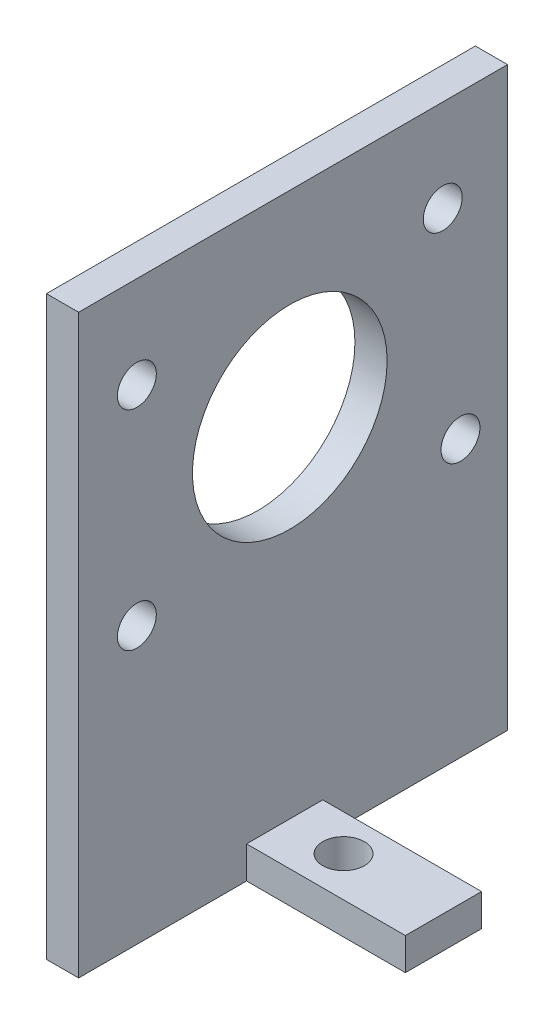
ISO-10303-21;
HEADER;
FILE_DESCRIPTION(('STEP AP214'),'2;1');
FILE_NAME('part.step','',(''),(''),'','','');
FILE_SCHEMA(('AUTOMOTIVE_DESIGN { 1 0 10303 214 1 1 1 1 }'));
ENDSEC;
DATA;
#1=APPLICATION_CONTEXT('core data for automotive mechanical design processes');
#2=APPLICATION_PROTOCOL_DEFINITION('international standard','automotive_design',2000,#1);
#3=PRODUCT_CONTEXT('',#1,'mechanical');
#4=PRODUCT('Part','Part','',(#3));
#5=PRODUCT_RELATED_PRODUCT_CATEGORY('part','',(#4));
#6=PRODUCT_DEFINITION_FORMATION('','',#4);
#7=PRODUCT_DEFINITION_CONTEXT('part definition',#1,'design');
#8=PRODUCT_DEFINITION('design','',#6,#7);
#9=PRODUCT_DEFINITION_SHAPE('','',#8);
#10=(LENGTH_UNIT() NAMED_UNIT(*) SI_UNIT(.MILLI.,.METRE.));
#11=(NAMED_UNIT(*) PLANE_ANGLE_UNIT() SI_UNIT($,.RADIAN.));
#12=(NAMED_UNIT(*) SI_UNIT($,.STERADIAN.) SOLID_ANGLE_UNIT());
#13=UNCERTAINTY_MEASURE_WITH_UNIT(LENGTH_MEASURE(1.E-05),#10,'distance_accuracy_value','');
#14=(GEOMETRIC_REPRESENTATION_CONTEXT(3) GLOBAL_UNCERTAINTY_ASSIGNED_CONTEXT((#13)) GLOBAL_UNIT_ASSIGNED_CONTEXT((#10,
#11,#12)) REPRESENTATION_CONTEXT('',''));
#15=CARTESIAN_POINT('',(0.,0.,0.));
#16=DIRECTION('',(0.,0.,1.));
#17=DIRECTION('',(1.,0.,0.));
#18=AXIS2_PLACEMENT_3D('',#15,#16,#17);
#19=CARTESIAN_POINT('',(0.,-2.3152007581077,-30.8520422786929));
#20=DIRECTION('',(0.,-1.,0.));
#21=DIRECTION('',(0.,0.,-1.));
#22=AXIS2_PLACEMENT_3D('',#19,#20,#21);
#23=PLANE('',#22);
#24=DIRECTION('',(0.,0.,1.));
#25=VECTOR('',#24,1.);
#26=CARTESIAN_POINT('',(11.4209266178207,-2.3152007581077,-17.5613531782531));
#27=LINE('',#26,#25);
#28=CARTESIAN_POINT('',(11.4209266178207,-2.3152007581077,-17.5613531782531));
#29=VERTEX_POINT('',#28);
#30=CARTESIAN_POINT('',(11.4209266178207,-2.3152007581077,-12.0811902968005));
#31=VERTEX_POINT('',#30);
#32=EDGE_CURVE('E57',#29,#31,#27,.T.);
#33=ORIENTED_EDGE('',*,*,#32,.T.);
#34=DIRECTION('',(-1.,0.,0.));
#35=VECTOR('',#34,1.);
#36=CARTESIAN_POINT('',(0.,-2.3152007581077,-12.0811902968005));
#37=LINE('',#36,#35);
#38=CARTESIAN_POINT('',(0.,-2.3152007581077,-12.0811902968005));
#39=VERTEX_POINT('',#38);
#40=EDGE_CURVE('E118',#31,#39,#37,.T.);
#41=ORIENTED_EDGE('',*,*,#40,.T.);
#42=DIRECTION('',(0.,0.,1.));
#43=VECTOR('',#42,1.);
#44=CARTESIAN_POINT('',(0.,-2.3152007581077,-12.0811902968005));
#45=LINE('',#44,#43);
#46=CARTESIAN_POINT('',(0.,-2.3152007581077,0.));
#47=VERTEX_POINT('',#46);
#48=EDGE_CURVE('E128',#39,#47,#45,.T.);
#49=ORIENTED_EDGE('',*,*,#48,.T.);
#50=DIRECTION('',(1.,0.,0.));
#51=VECTOR('',#50,1.);
#52=CARTESIAN_POINT('',(0.,-2.3152007581077,0.));
#53=LINE('',#52,#51);
#54=CARTESIAN_POINT('',(-2.3152007581077,-2.3152007581077,0.));
#55=VERTEX_POINT('',#54);
#56=EDGE_CURVE('E177',#55,#47,#53,.T.);
#57=ORIENTED_EDGE('',*,*,#56,.F.);
#58=DIRECTION('',(0.,0.,1.));
#59=VECTOR('',#58,1.);
#60=CARTESIAN_POINT('',(-2.3152007581077,-2.3152007581077,-30.8520422786929));
#61=LINE('',#60,#59);
#62=CARTESIAN_POINT('',(-2.3152007581077,-2.3152007581077,-30.8520422786929));
#63=VERTEX_POINT('',#62);
#64=EDGE_CURVE('E11',#63,#55,#61,.T.);
#65=ORIENTED_EDGE('',*,*,#64,.F.);
#66=DIRECTION('',(1.,0.,0.));
#67=VECTOR('',#66,1.);
#68=CARTESIAN_POINT('',(0.,-2.3152007581077,-30.8520422786929));
#69=LINE('',#68,#67);
#70=CARTESIAN_POINT('',(0.,-2.3152007581077,-30.8520422786929));
#71=VERTEX_POINT('',#70);
#72=EDGE_CURVE('E180',#63,#71,#69,.T.);
#73=ORIENTED_EDGE('',*,*,#72,.T.);
#74=DIRECTION('',(0.,0.,1.));
#75=VECTOR('',#74,1.);
#76=CARTESIAN_POINT('',(0.,-2.3152007581077,-30.8520422786929));
#77=LINE('',#76,#75);
#78=CARTESIAN_POINT('',(0.,-2.3152007581077,-17.5613531782531));
#79=VERTEX_POINT('',#78);
#80=EDGE_CURVE('E141',#71,#79,#77,.T.);
#81=ORIENTED_EDGE('',*,*,#80,.T.);
#82=DIRECTION('',(1.,0.,0.));
#83=VECTOR('',#82,1.);
#84=CARTESIAN_POINT('',(0.,-2.3152007581077,-17.5613531782531));
#85=LINE('',#84,#83);
#86=EDGE_CURVE('E122',#79,#29,#85,.T.);
#87=ORIENTED_EDGE('',*,*,#86,.T.);
#88=EDGE_LOOP('',(#33,#41,#49,#57,#65,#73,#81,#87));
#89=FACE_BOUND('',#88,.T.);
#90=CARTESIAN_POINT('',(4.09770822282445,-2.3152007581077,-14.9571336008761));
#91=DIRECTION('',(0.,1.,0.));
#92=DIRECTION('',(0.,0.,1.));
#93=AXIS2_PLACEMENT_3D('',#90,#91,#92);
#94=CIRCLE('',#93,1.5);
#95=CARTESIAN_POINT('',(4.09770822282445,-2.3152007581077,-13.4571336008761));
#96=VERTEX_POINT('',#95);
#97=EDGE_CURVE('E174',#96,#96,#94,.T.);
#98=ORIENTED_EDGE('',*,*,#97,.T.);
#99=EDGE_LOOP('',(#98));
#100=FACE_BOUND('',#99,.T.);
#101=ADVANCED_FACE('F41',(#89,#100),#23,.T.);
#102=CARTESIAN_POINT('',(-2.3152007581077,0.,-30.8520422786929));
#103=DIRECTION('',(-1.,0.,0.));
#104=DIRECTION('',(0.,0.,1.));
#105=AXIS2_PLACEMENT_3D('',#102,#103,#104);
#106=PLANE('',#105);
#107=CARTESIAN_POINT('',(-2.3152007581077,17.5394588112625,-4.18895445245238));
#108=DIRECTION('',(1.,0.,0.));
#109=DIRECTION('',(0.,0.,-1.));
#110=AXIS2_PLACEMENT_3D('',#107,#108,#109);
#111=CIRCLE('',#110,1.4);
#112=CARTESIAN_POINT('',(-2.3152007581077,17.5394588112625,-5.58895445245238));
#113=VERTEX_POINT('',#112);
#114=EDGE_CURVE('E154',#113,#113,#111,.T.);
#115=ORIENTED_EDGE('',*,*,#114,.T.);
#116=EDGE_LOOP('',(#115));
#117=FACE_BOUND('',#116,.T.);
#118=CARTESIAN_POINT('',(-2.3152007581077,32.5394588112625,-26.1889544524524));
#119=DIRECTION('',(1.,0.,0.));
#120=DIRECTION('',(0.,0.,-1.));
#121=AXIS2_PLACEMENT_3D('',#118,#119,#120);
#122=CIRCLE('',#121,1.4);
#123=CARTESIAN_POINT('',(-2.3152007581077,32.5394588112625,-27.5889544524524));
#124=VERTEX_POINT('',#123);
#125=EDGE_CURVE('E147',#124,#124,#122,.T.);
#126=ORIENTED_EDGE('',*,*,#125,.T.);
#127=EDGE_LOOP('',(#126));
#128=FACE_BOUND('',#127,.T.);
#129=CARTESIAN_POINT('',(-2.3152007581077,17.5394588112625,-27.4648791704041));
#130=DIRECTION('',(1.,0.,0.));
#131=DIRECTION('',(0.,0.,-1.));
#132=AXIS2_PLACEMENT_3D('',#129,#130,#131);
#133=CIRCLE('',#132,1.4);
#134=CARTESIAN_POINT('',(-2.3152007581077,17.5394588112625,-28.8648791704041));
#135=VERTEX_POINT('',#134);
#136=EDGE_CURVE('E130',#135,#135,#133,.T.);
#137=ORIENTED_EDGE('',*,*,#136,.T.);
#138=EDGE_LOOP('',(#137));
#139=FACE_BOUND('',#138,.T.);
#140=CARTESIAN_POINT('',(-2.3152007581077,32.5394588112625,-4.18895445245238));
#141=DIRECTION('',(1.,0.,0.));
#142=DIRECTION('',(0.,0.,-1.));
#143=AXIS2_PLACEMENT_3D('',#140,#141,#142);
#144=CIRCLE('',#143,1.4);
#145=CARTESIAN_POINT('',(-2.3152007581077,32.5394588112625,-5.58895445245238));
#146=VERTEX_POINT('',#145);
#147=EDGE_CURVE('E162',#146,#146,#144,.T.);
#148=ORIENTED_EDGE('',*,*,#147,.T.);
#149=EDGE_LOOP('',(#148));
#150=FACE_BOUND('',#149,.T.);
#151=CARTESIAN_POINT('',(-2.3152007581077,25.0394588112625,-15.1889544524524));
#152=DIRECTION('',(1.,0.,0.));
#153=DIRECTION('',(0.,0.,-1.));
#154=AXIS2_PLACEMENT_3D('',#151,#152,#153);
#155=CIRCLE('',#154,7.);
#156=CARTESIAN_POINT('',(-2.3152007581077,25.0394588112625,-22.1889544524524));
#157=VERTEX_POINT('',#156);
#158=EDGE_CURVE('E168',#157,#157,#155,.T.);
#159=ORIENTED_EDGE('',*,*,#158,.T.);
#160=EDGE_LOOP('',(#159));
#161=FACE_BOUND('',#160,.T.);
#162=DIRECTION('',(0.,1.,0.));
#163=VECTOR('',#162,1.);
#164=CARTESIAN_POINT('',(-2.3152007581077,0.,0.));
#165=LINE('',#164,#163);
#166=CARTESIAN_POINT('',(-2.3152007581077,39.156392732122,0.));
#167=VERTEX_POINT('',#166);
#168=EDGE_CURVE('E183',#167,#55,#165,.F.);
#169=ORIENTED_EDGE('',*,*,#168,.F.);
#170=DIRECTION('',(0.,0.,1.));
#171=VECTOR('',#170,1.);
#172=CARTESIAN_POINT('',(-2.3152007581077,39.156392732122,-30.8520422786929));
#173=LINE('',#172,#171);
#174=CARTESIAN_POINT('',(-2.3152007581077,39.156392732122,-30.8520422786929));
#175=VERTEX_POINT('',#174);
#176=EDGE_CURVE('E49',#175,#167,#173,.T.);
#177=ORIENTED_EDGE('',*,*,#176,.F.);
#178=DIRECTION('',(0.,1.,0.));
#179=VECTOR('',#178,1.);
#180=CARTESIAN_POINT('',(-2.3152007581077,0.,-30.8520422786929));
#181=LINE('',#180,#179);
#182=EDGE_CURVE('E187',#175,#63,#181,.F.);
#183=ORIENTED_EDGE('',*,*,#182,.T.);
#184=ORIENTED_EDGE('',*,*,#64,.T.);
#185=EDGE_LOOP('',(#169,#177,#183,#184));
#186=FACE_BOUND('',#185,.T.);
#187=ADVANCED_FACE('F215',(#117,#128,#139,#150,#161,#186),#106,.T.);
#188=CARTESIAN_POINT('',(-2.3152007581077,39.156392732122,-30.8520422786929));
#189=DIRECTION('',(0.,-1.,0.));
#190=DIRECTION('',(0.,0.,-1.));
#191=AXIS2_PLACEMENT_3D('',#188,#189,#190);
#192=PLANE('',#191);
#193=DIRECTION('',(1.,0.,0.));
#194=VECTOR('',#193,1.);
#195=CARTESIAN_POINT('',(-2.3152007581077,39.156392732122,0.));
#196=LINE('',#195,#194);
#197=CARTESIAN_POINT('',(0.,39.156392732122,0.));
#198=VERTEX_POINT('',#197);
#199=EDGE_CURVE('E194',#167,#198,#196,.T.);
#200=ORIENTED_EDGE('',*,*,#199,.T.);
#201=DIRECTION('',(0.,0.,1.));
#202=VECTOR('',#201,1.);
#203=CARTESIAN_POINT('',(0.,39.156392732122,-30.8520422786929));
#204=LINE('',#203,#202);
#205=CARTESIAN_POINT('',(0.,39.156392732122,-30.8520422786929));
#206=VERTEX_POINT('',#205);
#207=EDGE_CURVE('E198',#206,#198,#204,.T.);
#208=ORIENTED_EDGE('',*,*,#207,.F.);
#209=DIRECTION('',(1.,0.,0.));
#210=VECTOR('',#209,1.);
#211=CARTESIAN_POINT('',(-2.3152007581077,39.156392732122,-30.8520422786929));
#212=LINE('',#211,#210);
#213=EDGE_CURVE('E185',#175,#206,#212,.T.);
#214=ORIENTED_EDGE('',*,*,#213,.F.);
#215=ORIENTED_EDGE('',*,*,#176,.T.);
#216=EDGE_LOOP('',(#200,#208,#214,#215));
#217=FACE_BOUND('',#216,.T.);
#218=ADVANCED_FACE('F220',(#217),#192,.F.);
#219=CARTESIAN_POINT('',(0.,0.,-30.8520422786929));
#220=DIRECTION('',(-1.,0.,0.));
#221=DIRECTION('',(0.,0.,1.));
#222=AXIS2_PLACEMENT_3D('',#219,#220,#221);
#223=PLANE('',#222);
#224=CARTESIAN_POINT('',(0.,17.5394588112625,-4.18895445245238));
#225=DIRECTION('',(1.,0.,0.));
#226=DIRECTION('',(0.,0.,-1.));
#227=AXIS2_PLACEMENT_3D('',#224,#225,#226);
#228=CIRCLE('',#227,1.4);
#229=CARTESIAN_POINT('',(0.,17.5394588112625,-5.58895445245238));
#230=VERTEX_POINT('',#229);
#231=EDGE_CURVE('E150',#230,#230,#228,.T.);
#232=ORIENTED_EDGE('',*,*,#231,.F.);
#233=EDGE_LOOP('',(#232));
#234=FACE_BOUND('',#233,.T.);
#235=CARTESIAN_POINT('',(0.,32.5394588112625,-26.1889544524524));
#236=DIRECTION('',(1.,0.,0.));
#237=DIRECTION('',(0.,0.,-1.));
#238=AXIS2_PLACEMENT_3D('',#235,#236,#237);
#239=CIRCLE('',#238,1.4);
#240=CARTESIAN_POINT('',(0.,32.5394588112625,-27.5889544524524));
#241=VERTEX_POINT('',#240);
#242=EDGE_CURVE('E157',#241,#241,#239,.T.);
#243=ORIENTED_EDGE('',*,*,#242,.F.);
#244=EDGE_LOOP('',(#243));
#245=FACE_BOUND('',#244,.T.);
#246=CARTESIAN_POINT('',(0.,17.5394588112625,-27.4648791704041));
#247=DIRECTION('',(1.,0.,0.));
#248=DIRECTION('',(0.,0.,-1.));
#249=AXIS2_PLACEMENT_3D('',#246,#247,#248);
#250=CIRCLE('',#249,1.4);
#251=CARTESIAN_POINT('',(0.,17.5394588112625,-28.8648791704041));
#252=VERTEX_POINT('',#251);
#253=EDGE_CURVE('E144',#252,#252,#250,.T.);
#254=ORIENTED_EDGE('',*,*,#253,.F.);
#255=EDGE_LOOP('',(#254));
#256=FACE_BOUND('',#255,.T.);
#257=CARTESIAN_POINT('',(0.,32.5394588112625,-4.18895445245238));
#258=DIRECTION('',(1.,0.,0.));
#259=DIRECTION('',(0.,0.,-1.));
#260=AXIS2_PLACEMENT_3D('',#257,#258,#259);
#261=CIRCLE('',#260,1.4);
#262=CARTESIAN_POINT('',(0.,32.5394588112625,-5.58895445245238));
#263=VERTEX_POINT('',#262);
#264=EDGE_CURVE('E153',#263,#263,#261,.T.);
#265=ORIENTED_EDGE('',*,*,#264,.F.);
#266=EDGE_LOOP('',(#265));
#267=FACE_BOUND('',#266,.T.);
#268=CARTESIAN_POINT('',(0.,25.0394588112625,-15.1889544524524));
#269=DIRECTION('',(1.,0.,0.));
#270=DIRECTION('',(0.,0.,-1.));
#271=AXIS2_PLACEMENT_3D('',#268,#269,#270);
#272=CIRCLE('',#271,7.);
#273=CARTESIAN_POINT('',(0.,25.0394588112625,-22.1889544524524));
#274=VERTEX_POINT('',#273);
#275=EDGE_CURVE('E165',#274,#274,#272,.T.);
#276=ORIENTED_EDGE('',*,*,#275,.F.);
#277=EDGE_LOOP('',(#276));
#278=FACE_BOUND('',#277,.T.);
#279=DIRECTION('',(0.,-1.,0.));
#280=VECTOR('',#279,1.);
#281=CARTESIAN_POINT('',(0.,0.,0.));
#282=LINE('',#281,#280);
#283=EDGE_CURVE('E192',#198,#47,#282,.T.);
#284=ORIENTED_EDGE('',*,*,#283,.T.);
#285=ORIENTED_EDGE('',*,*,#48,.F.);
#286=DIRECTION('',(0.,1.,0.));
#287=VECTOR('',#286,1.);
#288=CARTESIAN_POINT('',(0.,-2.3152007581077,-12.0811902968005));
#289=LINE('',#288,#287);
#290=CARTESIAN_POINT('',(0.,0.,-12.0811902968005));
#291=VERTEX_POINT('',#290);
#292=EDGE_CURVE('E126',#39,#291,#289,.T.);
#293=ORIENTED_EDGE('',*,*,#292,.T.);
#294=DIRECTION('',(0.,0.,1.));
#295=VECTOR('',#294,1.);
#296=CARTESIAN_POINT('',(0.,0.,-30.8520422786929));
#297=LINE('',#296,#295);
#298=CARTESIAN_POINT('',(0.,0.,-17.5613531782531));
#299=VERTEX_POINT('',#298);
#300=EDGE_CURVE('E44',#299,#291,#297,.T.);
#301=ORIENTED_EDGE('',*,*,#300,.F.);
#302=DIRECTION('',(0.,1.,0.));
#303=VECTOR('',#302,1.);
#304=CARTESIAN_POINT('',(0.,-2.3152007581077,-17.5613531782531));
#305=LINE('',#304,#303);
#306=EDGE_CURVE('E137',#79,#299,#305,.T.);
#307=ORIENTED_EDGE('',*,*,#306,.F.);
#308=ORIENTED_EDGE('',*,*,#80,.F.);
#309=DIRECTION('',(0.,-1.,0.));
#310=VECTOR('',#309,1.);
#311=CARTESIAN_POINT('',(0.,0.,-30.8520422786929));
#312=LINE('',#311,#310);
#313=EDGE_CURVE('E65',#206,#71,#312,.T.);
#314=ORIENTED_EDGE('',*,*,#313,.F.);
#315=ORIENTED_EDGE('',*,*,#207,.T.);
#316=EDGE_LOOP('',(#284,#285,#293,#301,#307,#308,#314,#315));
#317=FACE_BOUND('',#316,.T.);
#318=ADVANCED_FACE('F208',(#234,#245,#256,#267,#278,#317),#223,.F.);
#319=CARTESIAN_POINT('',(0.,0.,-30.8520422786929));
#320=DIRECTION('',(0.,-1.,0.));
#321=DIRECTION('',(0.,0.,-1.));
#322=AXIS2_PLACEMENT_3D('',#319,#320,#321);
#323=PLANE('',#322);
#324=CARTESIAN_POINT('',(4.09770822282445,0.,-14.9571336008761));
#325=DIRECTION('',(0.,1.,0.));
#326=DIRECTION('',(0.,0.,1.));
#327=AXIS2_PLACEMENT_3D('',#324,#325,#326);
#328=CIRCLE('',#327,1.5);
#329=CARTESIAN_POINT('',(4.09770822282445,0.,-13.4571336008761));
#330=VERTEX_POINT('',#329);
#331=EDGE_CURVE('E171',#330,#330,#328,.T.);
#332=ORIENTED_EDGE('',*,*,#331,.F.);
#333=EDGE_LOOP('',(#332));
#334=FACE_BOUND('',#333,.T.);
#335=DIRECTION('',(-1.,0.,0.));
#336=VECTOR('',#335,1.);
#337=CARTESIAN_POINT('',(0.,0.,-12.0811902968005));
#338=LINE('',#337,#336);
#339=CARTESIAN_POINT('',(11.4209266178207,0.,-12.0811902968005));
#340=VERTEX_POINT('',#339);
#341=EDGE_CURVE('E132',#340,#291,#338,.T.);
#342=ORIENTED_EDGE('',*,*,#341,.F.);
#343=DIRECTION('',(0.,0.,1.));
#344=VECTOR('',#343,1.);
#345=CARTESIAN_POINT('',(11.4209266178207,0.,-17.5613531782531));
#346=LINE('',#345,#344);
#347=CARTESIAN_POINT('',(11.4209266178207,0.,-17.5613531782531));
#348=VERTEX_POINT('',#347);
#349=EDGE_CURVE('E108',#348,#340,#346,.T.);
#350=ORIENTED_EDGE('',*,*,#349,.F.);
#351=DIRECTION('',(1.,0.,0.));
#352=VECTOR('',#351,1.);
#353=CARTESIAN_POINT('',(0.,0.,-17.5613531782531));
#354=LINE('',#353,#352);
#355=EDGE_CURVE('E135',#299,#348,#354,.T.);
#356=ORIENTED_EDGE('',*,*,#355,.F.);
#357=ORIENTED_EDGE('',*,*,#300,.T.);
#358=EDGE_LOOP('',(#342,#350,#356,#357));
#359=FACE_BOUND('',#358,.T.);
#360=ADVANCED_FACE('F207',(#334,#359),#323,.F.);
#361=CARTESIAN_POINT('',(0.,0.,-30.8520422786929));
#362=DIRECTION('',(0.,0.,-1.));
#363=DIRECTION('',(-1.,0.,0.));
#364=AXIS2_PLACEMENT_3D('',#361,#362,#363);
#365=PLANE('',#364);
#366=ORIENTED_EDGE('',*,*,#313,.T.);
#367=ORIENTED_EDGE('',*,*,#72,.F.);
#368=ORIENTED_EDGE('',*,*,#182,.F.);
#369=ORIENTED_EDGE('',*,*,#213,.T.);
#370=EDGE_LOOP('',(#366,#367,#368,#369));
#371=FACE_BOUND('',#370,.T.);
#372=ADVANCED_FACE('F218',(#371),#365,.T.);
#373=CARTESIAN_POINT('',(0.,0.,0.));
#374=DIRECTION('',(0.,0.,-1.));
#375=DIRECTION('',(-1.,0.,0.));
#376=AXIS2_PLACEMENT_3D('',#373,#374,#375);
#377=PLANE('',#376);
#378=ORIENTED_EDGE('',*,*,#56,.T.);
#379=ORIENTED_EDGE('',*,*,#283,.F.);
#380=ORIENTED_EDGE('',*,*,#199,.F.);
#381=ORIENTED_EDGE('',*,*,#168,.T.);
#382=EDGE_LOOP('',(#378,#379,#380,#381));
#383=FACE_BOUND('',#382,.T.);
#384=ADVANCED_FACE('F211',(#383),#377,.F.);
#385=CARTESIAN_POINT('',(4.09770822282445,-2.3152007581077,-14.9571336008761));
#386=DIRECTION('',(0.,1.,0.));
#387=DIRECTION('',(0.,0.,1.));
#388=AXIS2_PLACEMENT_3D('',#385,#386,#387);
#389=CYLINDRICAL_SURFACE('',#388,1.5);
#390=ORIENTED_EDGE('',*,*,#97,.F.);
#391=EDGE_LOOP('',(#390));
#392=FACE_BOUND('',#391,.T.);
#393=ORIENTED_EDGE('',*,*,#331,.T.);
#394=EDGE_LOOP('',(#393));
#395=FACE_BOUND('',#394,.T.);
#396=ADVANCED_FACE('F322',(#392,#395),#389,.F.);
#397=CARTESIAN_POINT('',(-2.3152007581077,25.0394588112625,-15.1889544524524));
#398=DIRECTION('',(1.,0.,0.));
#399=DIRECTION('',(0.,0.,-1.));
#400=AXIS2_PLACEMENT_3D('',#397,#398,#399);
#401=CYLINDRICAL_SURFACE('',#400,7.);
#402=ORIENTED_EDGE('',*,*,#158,.F.);
#403=EDGE_LOOP('',(#402));
#404=FACE_BOUND('',#403,.T.);
#405=ORIENTED_EDGE('',*,*,#275,.T.);
#406=EDGE_LOOP('',(#405));
#407=FACE_BOUND('',#406,.T.);
#408=ADVANCED_FACE('F313',(#404,#407),#401,.F.);
#409=CARTESIAN_POINT('',(-2.3152007581077,32.5394588112625,-4.18895445245238));
#410=DIRECTION('',(1.,0.,0.));
#411=DIRECTION('',(0.,0.,-1.));
#412=AXIS2_PLACEMENT_3D('',#409,#410,#411);
#413=CYLINDRICAL_SURFACE('',#412,1.4);
#414=ORIENTED_EDGE('',*,*,#147,.F.);
#415=EDGE_LOOP('',(#414));
#416=FACE_BOUND('',#415,.T.);
#417=ORIENTED_EDGE('',*,*,#264,.T.);
#418=EDGE_LOOP('',(#417));
#419=FACE_BOUND('',#418,.T.);
#420=ADVANCED_FACE('F304',(#416,#419),#413,.F.);
#421=CARTESIAN_POINT('',(-2.3152007581077,17.5394588112625,-27.4648791704041));
#422=DIRECTION('',(1.,0.,0.));
#423=DIRECTION('',(0.,0.,-1.));
#424=AXIS2_PLACEMENT_3D('',#421,#422,#423);
#425=CYLINDRICAL_SURFACE('',#424,1.4);
#426=ORIENTED_EDGE('',*,*,#136,.F.);
#427=EDGE_LOOP('',(#426));
#428=FACE_BOUND('',#427,.T.);
#429=ORIENTED_EDGE('',*,*,#253,.T.);
#430=EDGE_LOOP('',(#429));
#431=FACE_BOUND('',#430,.T.);
#432=ADVANCED_FACE('F295',(#428,#431),#425,.F.);
#433=CARTESIAN_POINT('',(-2.3152007581077,32.5394588112625,-26.1889544524524));
#434=DIRECTION('',(1.,0.,0.));
#435=DIRECTION('',(0.,0.,-1.));
#436=AXIS2_PLACEMENT_3D('',#433,#434,#435);
#437=CYLINDRICAL_SURFACE('',#436,1.4);
#438=ORIENTED_EDGE('',*,*,#125,.F.);
#439=EDGE_LOOP('',(#438));
#440=FACE_BOUND('',#439,.T.);
#441=ORIENTED_EDGE('',*,*,#242,.T.);
#442=EDGE_LOOP('',(#441));
#443=FACE_BOUND('',#442,.T.);
#444=ADVANCED_FACE('F285',(#440,#443),#437,.F.);
#445=CARTESIAN_POINT('',(-2.3152007581077,17.5394588112625,-4.18895445245238));
#446=DIRECTION('',(1.,0.,0.));
#447=DIRECTION('',(0.,0.,-1.));
#448=AXIS2_PLACEMENT_3D('',#445,#446,#447);
#449=CYLINDRICAL_SURFACE('',#448,1.4);
#450=ORIENTED_EDGE('',*,*,#114,.F.);
#451=EDGE_LOOP('',(#450));
#452=FACE_BOUND('',#451,.T.);
#453=ORIENTED_EDGE('',*,*,#231,.T.);
#454=EDGE_LOOP('',(#453));
#455=FACE_BOUND('',#454,.T.);
#456=ADVANCED_FACE('F257',(#452,#455),#449,.F.);
#457=CARTESIAN_POINT('',(0.,-2.3152007581077,-12.0811902968005));
#458=DIRECTION('',(0.,0.,-1.));
#459=DIRECTION('',(-1.,0.,0.));
#460=AXIS2_PLACEMENT_3D('',#457,#458,#459);
#461=PLANE('',#460);
#462=ORIENTED_EDGE('',*,*,#40,.F.);
#463=DIRECTION('',(0.,1.,0.));
#464=VECTOR('',#463,1.);
#465=CARTESIAN_POINT('',(11.4209266178207,-2.3152007581077,-12.0811902968005));
#466=LINE('',#465,#464);
#467=EDGE_CURVE('E105',#31,#340,#466,.T.);
#468=ORIENTED_EDGE('',*,*,#467,.T.);
#469=ORIENTED_EDGE('',*,*,#341,.T.);
#470=ORIENTED_EDGE('',*,*,#292,.F.);
#471=EDGE_LOOP('',(#462,#468,#469,#470));
#472=FACE_BOUND('',#471,.T.);
#473=ADVANCED_FACE('F124',(#472),#461,.F.);
#474=CARTESIAN_POINT('',(0.,-2.3152007581077,-17.5613531782531));
#475=DIRECTION('',(0.,0.,1.));
#476=DIRECTION('',(1.,0.,0.));
#477=AXIS2_PLACEMENT_3D('',#474,#475,#476);
#478=PLANE('',#477);
#479=ORIENTED_EDGE('',*,*,#355,.T.);
#480=DIRECTION('',(0.,1.,0.));
#481=VECTOR('',#480,1.);
#482=CARTESIAN_POINT('',(11.4209266178207,-2.3152007581077,-17.5613531782531));
#483=LINE('',#482,#481);
#484=EDGE_CURVE('E112',#29,#348,#483,.T.);
#485=ORIENTED_EDGE('',*,*,#484,.F.);
#486=ORIENTED_EDGE('',*,*,#86,.F.);
#487=ORIENTED_EDGE('',*,*,#306,.T.);
#488=EDGE_LOOP('',(#479,#485,#486,#487));
#489=FACE_BOUND('',#488,.T.);
#490=ADVANCED_FACE('F256',(#489),#478,.F.);
#491=CARTESIAN_POINT('',(11.4209266178207,-2.3152007581077,-17.5613531782531));
#492=DIRECTION('',(-1.,0.,0.));
#493=DIRECTION('',(0.,0.,1.));
#494=AXIS2_PLACEMENT_3D('',#491,#492,#493);
#495=PLANE('',#494);
#496=ORIENTED_EDGE('',*,*,#349,.T.);
#497=ORIENTED_EDGE('',*,*,#467,.F.);
#498=ORIENTED_EDGE('',*,*,#32,.F.);
#499=ORIENTED_EDGE('',*,*,#484,.T.);
#500=EDGE_LOOP('',(#496,#497,#498,#499));
#501=FACE_BOUND('',#500,.T.);
#502=ADVANCED_FACE('F106',(#501),#495,.F.);
#503=CLOSED_SHELL('',(#101,#187,#218,#318,#360,#372,#384,#396,#408,#420,#432,#444,#456,#473,
#490,#502));
#504=MANIFOLD_SOLID_BREP('B2',#503);
#505=ADVANCED_BREP_SHAPE_REPRESENTATION('',(#18,#504),#14);
#506=SHAPE_DEFINITION_REPRESENTATION(#9,#505);
ENDSEC;
END-ISO-10303-21;
